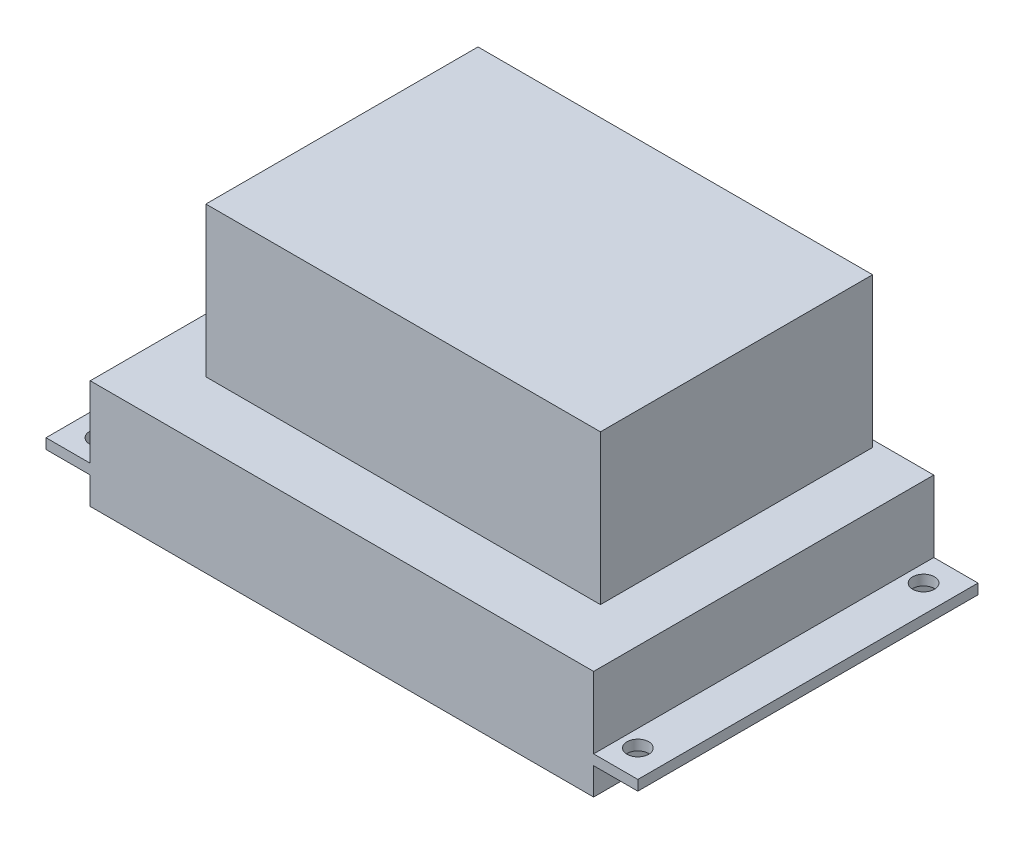
ISO-10303-21;
HEADER;
FILE_DESCRIPTION(('STEP AP214'),'2;1');
FILE_NAME('part.step','',(''),(''),'','','');
FILE_SCHEMA(('AUTOMOTIVE_DESIGN { 1 0 10303 214 1 1 1 1 }'));
ENDSEC;
DATA;
#1=APPLICATION_CONTEXT('core data for automotive mechanical design processes');
#2=APPLICATION_PROTOCOL_DEFINITION('international standard','automotive_design',2000,#1);
#3=PRODUCT_CONTEXT('',#1,'mechanical');
#4=PRODUCT('Part','Part','',(#3));
#5=PRODUCT_RELATED_PRODUCT_CATEGORY('part','',(#4));
#6=PRODUCT_DEFINITION_FORMATION('','',#4);
#7=PRODUCT_DEFINITION_CONTEXT('part definition',#1,'design');
#8=PRODUCT_DEFINITION('design','',#6,#7);
#9=PRODUCT_DEFINITION_SHAPE('','',#8);
#10=(LENGTH_UNIT() NAMED_UNIT(*) SI_UNIT(.MILLI.,.METRE.));
#11=(NAMED_UNIT(*) PLANE_ANGLE_UNIT() SI_UNIT($,.RADIAN.));
#12=(NAMED_UNIT(*) SI_UNIT($,.STERADIAN.) SOLID_ANGLE_UNIT());
#13=UNCERTAINTY_MEASURE_WITH_UNIT(LENGTH_MEASURE(1.E-05),#10,'distance_accuracy_value','');
#14=(GEOMETRIC_REPRESENTATION_CONTEXT(3) GLOBAL_UNCERTAINTY_ASSIGNED_CONTEXT((#13)) GLOBAL_UNIT_ASSIGNED_CONTEXT((#10,
#11,#12)) REPRESENTATION_CONTEXT('',''));
#15=CARTESIAN_POINT('',(0.,0.,0.));
#16=DIRECTION('',(0.,0.,1.));
#17=DIRECTION('',(1.,0.,0.));
#18=AXIS2_PLACEMENT_3D('',#15,#16,#17);
#19=CARTESIAN_POINT('',(0.,1.5,0.));
#20=DIRECTION('',(0.,-1.,0.));
#21=DIRECTION('',(0.,0.,-1.));
#22=AXIS2_PLACEMENT_3D('',#19,#20,#21);
#23=PLANE('',#22);
#24=CARTESIAN_POINT('',(39.4999999999998,1.5,-21.0000000000004));
#25=DIRECTION('',(0.,1.,0.));
#26=DIRECTION('',(0.,0.,-1.));
#27=AXIS2_PLACEMENT_3D('',#24,#25,#26);
#28=CIRCLE('',#27,1.6);
#29=CARTESIAN_POINT('',(39.4999999999998,1.5,-22.6000000000004));
#30=VERTEX_POINT('',#29);
#31=EDGE_CURVE('E249',#30,#30,#28,.T.);
#32=ORIENTED_EDGE('',*,*,#31,.F.);
#33=EDGE_LOOP('',(#32));
#34=FACE_BOUND('',#33,.T.);
#35=CARTESIAN_POINT('',(39.5000000000001,1.5,20.9999999999998));
#36=DIRECTION('',(0.,1.,0.));
#37=DIRECTION('',(0.,0.,1.));
#38=AXIS2_PLACEMENT_3D('',#35,#36,#37);
#39=CIRCLE('',#38,1.6);
#40=CARTESIAN_POINT('',(39.5000000000001,1.5,22.5999999999998));
#41=VERTEX_POINT('',#40);
#42=EDGE_CURVE('E257',#41,#41,#39,.T.);
#43=ORIENTED_EDGE('',*,*,#42,.F.);
#44=EDGE_LOOP('',(#43));
#45=FACE_BOUND('',#44,.T.);
#46=DIRECTION('',(-1.,0.,0.));
#47=VECTOR('',#46,1.);
#48=CARTESIAN_POINT('',(-43.5,1.5,-25.));
#49=LINE('',#48,#47);
#50=CARTESIAN_POINT('',(43.5,1.5,-25.));
#51=VERTEX_POINT('',#50);
#52=CARTESIAN_POINT('',(37.,1.5,-25.));
#53=VERTEX_POINT('',#52);
#54=EDGE_CURVE('E287',#51,#53,#49,.T.);
#55=ORIENTED_EDGE('',*,*,#54,.T.);
#56=DIRECTION('',(0.,0.,1.));
#57=VECTOR('',#56,1.);
#58=CARTESIAN_POINT('',(37.,1.5,0.));
#59=LINE('',#58,#57);
#60=CARTESIAN_POINT('',(37.,1.5,25.));
#61=VERTEX_POINT('',#60);
#62=EDGE_CURVE('E244',#53,#61,#59,.T.);
#63=ORIENTED_EDGE('',*,*,#62,.T.);
#64=DIRECTION('',(1.,0.,0.));
#65=VECTOR('',#64,1.);
#66=CARTESIAN_POINT('',(-43.5,1.5,25.));
#67=LINE('',#66,#65);
#68=CARTESIAN_POINT('',(43.5,1.5,25.));
#69=VERTEX_POINT('',#68);
#70=EDGE_CURVE('E293',#61,#69,#67,.T.);
#71=ORIENTED_EDGE('',*,*,#70,.T.);
#72=DIRECTION('',(0.,0.,-1.));
#73=VECTOR('',#72,1.);
#74=CARTESIAN_POINT('',(43.5,1.5,25.));
#75=LINE('',#74,#73);
#76=EDGE_CURVE('E281',#69,#51,#75,.T.);
#77=ORIENTED_EDGE('',*,*,#76,.T.);
#78=EDGE_LOOP('',(#55,#63,#71,#77));
#79=FACE_BOUND('',#78,.T.);
#80=ADVANCED_FACE('F39',(#34,#45,#79),#23,.F.);
#81=CARTESIAN_POINT('',(0.,0.,0.));
#82=DIRECTION('',(0.,-1.,0.));
#83=DIRECTION('',(0.,0.,-1.));
#84=AXIS2_PLACEMENT_3D('',#81,#82,#83);
#85=PLANE('',#84);
#86=DIRECTION('',(0.,0.,1.));
#87=VECTOR('',#86,1.);
#88=CARTESIAN_POINT('',(37.,0.,0.));
#89=LINE('',#88,#87);
#90=CARTESIAN_POINT('',(37.,0.,-25.));
#91=VERTEX_POINT('',#90);
#92=CARTESIAN_POINT('',(37.,0.,25.));
#93=VERTEX_POINT('',#92);
#94=EDGE_CURVE('E240',#91,#93,#89,.T.);
#95=ORIENTED_EDGE('',*,*,#94,.F.);
#96=DIRECTION('',(-1.,0.,0.));
#97=VECTOR('',#96,1.);
#98=CARTESIAN_POINT('',(-43.5,0.,-25.));
#99=LINE('',#98,#97);
#100=CARTESIAN_POINT('',(43.5,0.,-25.));
#101=VERTEX_POINT('',#100);
#102=EDGE_CURVE('E302',#101,#91,#99,.T.);
#103=ORIENTED_EDGE('',*,*,#102,.F.);
#104=DIRECTION('',(0.,0.,-1.));
#105=VECTOR('',#104,1.);
#106=CARTESIAN_POINT('',(43.5,0.,25.));
#107=LINE('',#106,#105);
#108=CARTESIAN_POINT('',(43.5,0.,25.));
#109=VERTEX_POINT('',#108);
#110=EDGE_CURVE('E277',#109,#101,#107,.T.);
#111=ORIENTED_EDGE('',*,*,#110,.F.);
#112=DIRECTION('',(1.,0.,0.));
#113=VECTOR('',#112,1.);
#114=CARTESIAN_POINT('',(-43.5,0.,25.));
#115=LINE('',#114,#113);
#116=EDGE_CURVE('E309',#93,#109,#115,.T.);
#117=ORIENTED_EDGE('',*,*,#116,.F.);
#118=EDGE_LOOP('',(#95,#103,#111,#117));
#119=FACE_BOUND('',#118,.T.);
#120=CARTESIAN_POINT('',(39.4999999999998,0.,-21.0000000000004));
#121=DIRECTION('',(0.,1.,0.));
#122=DIRECTION('',(0.,0.,-1.));
#123=AXIS2_PLACEMENT_3D('',#120,#121,#122);
#124=CIRCLE('',#123,1.6);
#125=CARTESIAN_POINT('',(39.4999999999998,0.,-22.6000000000004));
#126=VERTEX_POINT('',#125);
#127=EDGE_CURVE('E248',#126,#126,#124,.T.);
#128=ORIENTED_EDGE('',*,*,#127,.T.);
#129=EDGE_LOOP('',(#128));
#130=FACE_BOUND('',#129,.T.);
#131=CARTESIAN_POINT('',(39.5000000000001,0.,20.9999999999998));
#132=DIRECTION('',(0.,1.,0.));
#133=DIRECTION('',(0.,0.,1.));
#134=AXIS2_PLACEMENT_3D('',#131,#132,#133);
#135=CIRCLE('',#134,1.6);
#136=CARTESIAN_POINT('',(39.5000000000001,0.,22.5999999999998));
#137=VERTEX_POINT('',#136);
#138=EDGE_CURVE('E253',#137,#137,#135,.T.);
#139=ORIENTED_EDGE('',*,*,#138,.T.);
#140=EDGE_LOOP('',(#139));
#141=FACE_BOUND('',#140,.T.);
#142=ADVANCED_FACE('F366',(#119,#130,#141),#85,.T.);
#143=CARTESIAN_POINT('',(-43.5,1.5,25.));
#144=VERTEX_POINT('',#143);
#145=CARTESIAN_POINT('',(-37.,1.5,25.));
#146=VERTEX_POINT('',#145);
#147=EDGE_CURVE('E294',#144,#146,#67,.T.);
#148=ORIENTED_EDGE('',*,*,#147,.T.);
#149=DIRECTION('',(0.,0.,-1.));
#150=VECTOR('',#149,1.);
#151=CARTESIAN_POINT('',(-37.,1.5,0.));
#152=LINE('',#151,#150);
#153=CARTESIAN_POINT('',(-37.,1.5,-25.));
#154=VERTEX_POINT('',#153);
#155=EDGE_CURVE('E237',#146,#154,#152,.T.);
#156=ORIENTED_EDGE('',*,*,#155,.T.);
#157=CARTESIAN_POINT('',(-43.5,1.5,-25.));
#158=VERTEX_POINT('',#157);
#159=EDGE_CURVE('E285',#154,#158,#49,.T.);
#160=ORIENTED_EDGE('',*,*,#159,.T.);
#161=DIRECTION('',(0.,0.,1.));
#162=VECTOR('',#161,1.);
#163=CARTESIAN_POINT('',(-43.5,1.5,25.));
#164=LINE('',#163,#162);
#165=EDGE_CURVE('E290',#158,#144,#164,.T.);
#166=ORIENTED_EDGE('',*,*,#165,.T.);
#167=EDGE_LOOP('',(#148,#156,#160,#166));
#168=FACE_BOUND('',#167,.T.);
#169=CARTESIAN_POINT('',(-39.5,1.5,-21.));
#170=DIRECTION('',(0.,1.,0.));
#171=DIRECTION('',(0.,0.,1.));
#172=AXIS2_PLACEMENT_3D('',#169,#170,#171);
#173=CIRCLE('',#172,1.6);
#174=CARTESIAN_POINT('',(-39.5,1.5,-19.4));
#175=VERTEX_POINT('',#174);
#176=EDGE_CURVE('E273',#175,#175,#173,.T.);
#177=ORIENTED_EDGE('',*,*,#176,.F.);
#178=EDGE_LOOP('',(#177));
#179=FACE_BOUND('',#178,.T.);
#180=CARTESIAN_POINT('',(-39.5,1.5,21.));
#181=DIRECTION('',(0.,1.,0.));
#182=DIRECTION('',(0.,0.,-1.));
#183=AXIS2_PLACEMENT_3D('',#180,#181,#182);
#184=CIRCLE('',#183,1.6);
#185=CARTESIAN_POINT('',(-39.5,1.5,19.4));
#186=VERTEX_POINT('',#185);
#187=EDGE_CURVE('E265',#186,#186,#184,.T.);
#188=ORIENTED_EDGE('',*,*,#187,.F.);
#189=EDGE_LOOP('',(#188));
#190=FACE_BOUND('',#189,.T.);
#191=ADVANCED_FACE('F341',(#168,#179,#190),#23,.F.);
#192=DIRECTION('',(0.,0.,-1.));
#193=VECTOR('',#192,1.);
#194=CARTESIAN_POINT('',(-37.,0.,0.));
#195=LINE('',#194,#193);
#196=CARTESIAN_POINT('',(-37.,0.,25.));
#197=VERTEX_POINT('',#196);
#198=CARTESIAN_POINT('',(-37.,0.,-25.));
#199=VERTEX_POINT('',#198);
#200=EDGE_CURVE('E219',#197,#199,#195,.T.);
#201=ORIENTED_EDGE('',*,*,#200,.F.);
#202=CARTESIAN_POINT('',(-43.5,0.,25.));
#203=VERTEX_POINT('',#202);
#204=EDGE_CURVE('E286',#203,#197,#115,.T.);
#205=ORIENTED_EDGE('',*,*,#204,.F.);
#206=DIRECTION('',(0.,0.,1.));
#207=VECTOR('',#206,1.);
#208=CARTESIAN_POINT('',(-43.5,0.,25.));
#209=LINE('',#208,#207);
#210=CARTESIAN_POINT('',(-43.5,0.,-25.));
#211=VERTEX_POINT('',#210);
#212=EDGE_CURVE('E306',#211,#203,#209,.T.);
#213=ORIENTED_EDGE('',*,*,#212,.F.);
#214=EDGE_CURVE('E301',#199,#211,#99,.T.);
#215=ORIENTED_EDGE('',*,*,#214,.F.);
#216=EDGE_LOOP('',(#201,#205,#213,#215));
#217=FACE_BOUND('',#216,.T.);
#218=CARTESIAN_POINT('',(-39.5,0.,-21.));
#219=DIRECTION('',(0.,1.,0.));
#220=DIRECTION('',(0.,0.,1.));
#221=AXIS2_PLACEMENT_3D('',#218,#219,#220);
#222=CIRCLE('',#221,1.6);
#223=CARTESIAN_POINT('',(-39.5,0.,-19.4));
#224=VERTEX_POINT('',#223);
#225=EDGE_CURVE('E269',#224,#224,#222,.T.);
#226=ORIENTED_EDGE('',*,*,#225,.T.);
#227=EDGE_LOOP('',(#226));
#228=FACE_BOUND('',#227,.T.);
#229=CARTESIAN_POINT('',(-39.5,0.,21.));
#230=DIRECTION('',(0.,1.,0.));
#231=DIRECTION('',(0.,0.,-1.));
#232=AXIS2_PLACEMENT_3D('',#229,#230,#231);
#233=CIRCLE('',#232,1.6);
#234=CARTESIAN_POINT('',(-39.5,0.,19.4));
#235=VERTEX_POINT('',#234);
#236=EDGE_CURVE('E261',#235,#235,#233,.T.);
#237=ORIENTED_EDGE('',*,*,#236,.T.);
#238=EDGE_LOOP('',(#237));
#239=FACE_BOUND('',#238,.T.);
#240=ADVANCED_FACE('F333',(#217,#228,#239),#85,.T.);
#241=CARTESIAN_POINT('',(43.5,1.5,25.));
#242=DIRECTION('',(-1.,0.,0.));
#243=DIRECTION('',(0.,0.,1.));
#244=AXIS2_PLACEMENT_3D('',#241,#242,#243);
#245=PLANE('',#244);
#246=ORIENTED_EDGE('',*,*,#110,.T.);
#247=DIRECTION('',(0.,-1.,0.));
#248=VECTOR('',#247,1.);
#249=CARTESIAN_POINT('',(43.5,1.5,-25.));
#250=LINE('',#249,#248);
#251=EDGE_CURVE('E11',#51,#101,#250,.T.);
#252=ORIENTED_EDGE('',*,*,#251,.F.);
#253=ORIENTED_EDGE('',*,*,#76,.F.);
#254=DIRECTION('',(0.,-1.,0.));
#255=VECTOR('',#254,1.);
#256=CARTESIAN_POINT('',(43.5,1.5,25.));
#257=LINE('',#256,#255);
#258=EDGE_CURVE('E297',#69,#109,#257,.T.);
#259=ORIENTED_EDGE('',*,*,#258,.T.);
#260=EDGE_LOOP('',(#246,#252,#253,#259));
#261=FACE_BOUND('',#260,.T.);
#262=ADVANCED_FACE('F41',(#261),#245,.F.);
#263=CARTESIAN_POINT('',(-43.5,1.5,-25.));
#264=DIRECTION('',(0.,0.,1.));
#265=DIRECTION('',(1.,0.,0.));
#266=AXIS2_PLACEMENT_3D('',#263,#264,#265);
#267=PLANE('',#266);
#268=ORIENTED_EDGE('',*,*,#159,.F.);
#269=DIRECTION('',(0.,-1.,0.));
#270=VECTOR('',#269,1.);
#271=CARTESIAN_POINT('',(-37.,12.,-25.));
#272=LINE('',#271,#270);
#273=CARTESIAN_POINT('',(-37.,12.,-25.));
#274=VERTEX_POINT('',#273);
#275=EDGE_CURVE('E221',#274,#154,#272,.T.);
#276=ORIENTED_EDGE('',*,*,#275,.F.);
#277=DIRECTION('',(1.,0.,0.));
#278=VECTOR('',#277,1.);
#279=CARTESIAN_POINT('',(-37.,12.,-25.));
#280=LINE('',#279,#278);
#281=CARTESIAN_POINT('',(37.,12.,-25.));
#282=VERTEX_POINT('',#281);
#283=EDGE_CURVE('E210',#274,#282,#280,.T.);
#284=ORIENTED_EDGE('',*,*,#283,.T.);
#285=DIRECTION('',(0.,-1.,0.));
#286=VECTOR('',#285,1.);
#287=CARTESIAN_POINT('',(37.,12.,-25.));
#288=LINE('',#287,#286);
#289=EDGE_CURVE('E215',#282,#53,#288,.T.);
#290=ORIENTED_EDGE('',*,*,#289,.T.);
#291=ORIENTED_EDGE('',*,*,#54,.F.);
#292=ORIENTED_EDGE('',*,*,#251,.T.);
#293=ORIENTED_EDGE('',*,*,#102,.T.);
#294=CARTESIAN_POINT('',(37.,-4.,-25.));
#295=VERTEX_POINT('',#294);
#296=EDGE_CURVE('E220',#91,#295,#288,.T.);
#297=ORIENTED_EDGE('',*,*,#296,.T.);
#298=DIRECTION('',(1.,0.,0.));
#299=VECTOR('',#298,1.);
#300=CARTESIAN_POINT('',(-37.,-4.,-25.));
#301=LINE('',#300,#299);
#302=CARTESIAN_POINT('',(-37.,-4.,-25.));
#303=VERTEX_POINT('',#302);
#304=EDGE_CURVE('E194',#303,#295,#301,.T.);
#305=ORIENTED_EDGE('',*,*,#304,.F.);
#306=EDGE_CURVE('E225',#199,#303,#272,.T.);
#307=ORIENTED_EDGE('',*,*,#306,.F.);
#308=ORIENTED_EDGE('',*,*,#214,.T.);
#309=DIRECTION('',(0.,-1.,0.));
#310=VECTOR('',#309,1.);
#311=CARTESIAN_POINT('',(-43.5,1.5,-25.));
#312=LINE('',#311,#310);
#313=EDGE_CURVE('E48',#158,#211,#312,.T.);
#314=ORIENTED_EDGE('',*,*,#313,.F.);
#315=EDGE_LOOP('',(#268,#276,#284,#290,#291,#292,#293,#297,#305,#307,#308,#314));
#316=FACE_BOUND('',#315,.T.);
#317=ADVANCED_FACE('F347',(#316),#267,.F.);
#318=CARTESIAN_POINT('',(-43.5,1.5,25.));
#319=DIRECTION('',(1.,0.,0.));
#320=DIRECTION('',(0.,0.,-1.));
#321=AXIS2_PLACEMENT_3D('',#318,#319,#320);
#322=PLANE('',#321);
#323=ORIENTED_EDGE('',*,*,#212,.T.);
#324=DIRECTION('',(0.,-1.,0.));
#325=VECTOR('',#324,1.);
#326=CARTESIAN_POINT('',(-43.5,1.5,25.));
#327=LINE('',#326,#325);
#328=EDGE_CURVE('E316',#144,#203,#327,.T.);
#329=ORIENTED_EDGE('',*,*,#328,.F.);
#330=ORIENTED_EDGE('',*,*,#165,.F.);
#331=ORIENTED_EDGE('',*,*,#313,.T.);
#332=EDGE_LOOP('',(#323,#329,#330,#331));
#333=FACE_BOUND('',#332,.T.);
#334=ADVANCED_FACE('F325',(#333),#322,.F.);
#335=CARTESIAN_POINT('',(-43.5,1.5,25.));
#336=DIRECTION('',(0.,0.,-1.));
#337=DIRECTION('',(-1.,0.,0.));
#338=AXIS2_PLACEMENT_3D('',#335,#336,#337);
#339=PLANE('',#338);
#340=ORIENTED_EDGE('',*,*,#204,.T.);
#341=DIRECTION('',(0.,-1.,0.));
#342=VECTOR('',#341,1.);
#343=CARTESIAN_POINT('',(-37.,12.,25.));
#344=LINE('',#343,#342);
#345=CARTESIAN_POINT('',(-37.,-4.,25.));
#346=VERTEX_POINT('',#345);
#347=EDGE_CURVE('E230',#197,#346,#344,.T.);
#348=ORIENTED_EDGE('',*,*,#347,.T.);
#349=DIRECTION('',(-1.,0.,0.));
#350=VECTOR('',#349,1.);
#351=CARTESIAN_POINT('',(-37.,-4.,25.));
#352=LINE('',#351,#350);
#353=CARTESIAN_POINT('',(37.,-4.,25.));
#354=VERTEX_POINT('',#353);
#355=EDGE_CURVE('E181',#354,#346,#352,.T.);
#356=ORIENTED_EDGE('',*,*,#355,.F.);
#357=DIRECTION('',(0.,-1.,0.));
#358=VECTOR('',#357,1.);
#359=CARTESIAN_POINT('',(37.,12.,25.));
#360=LINE('',#359,#358);
#361=EDGE_CURVE('E214',#93,#354,#360,.T.);
#362=ORIENTED_EDGE('',*,*,#361,.F.);
#363=ORIENTED_EDGE('',*,*,#116,.T.);
#364=ORIENTED_EDGE('',*,*,#258,.F.);
#365=ORIENTED_EDGE('',*,*,#70,.F.);
#366=CARTESIAN_POINT('',(37.,12.,25.));
#367=VERTEX_POINT('',#366);
#368=EDGE_CURVE('E231',#367,#61,#360,.T.);
#369=ORIENTED_EDGE('',*,*,#368,.F.);
#370=DIRECTION('',(-1.,0.,0.));
#371=VECTOR('',#370,1.);
#372=CARTESIAN_POINT('',(-37.,12.,25.));
#373=LINE('',#372,#371);
#374=CARTESIAN_POINT('',(-37.,12.,25.));
#375=VERTEX_POINT('',#374);
#376=EDGE_CURVE('E202',#367,#375,#373,.T.);
#377=ORIENTED_EDGE('',*,*,#376,.T.);
#378=EDGE_CURVE('E226',#375,#146,#344,.T.);
#379=ORIENTED_EDGE('',*,*,#378,.T.);
#380=ORIENTED_EDGE('',*,*,#147,.F.);
#381=ORIENTED_EDGE('',*,*,#328,.T.);
#382=EDGE_LOOP('',(#340,#348,#356,#362,#363,#364,#365,#369,#377,#379,#380,#381));
#383=FACE_BOUND('',#382,.T.);
#384=ADVANCED_FACE('F336',(#383),#339,.F.);
#385=CARTESIAN_POINT('',(-39.5,1.5,-21.));
#386=DIRECTION('',(0.,-1.,0.));
#387=DIRECTION('',(0.,0.,-1.));
#388=AXIS2_PLACEMENT_3D('',#385,#386,#387);
#389=CYLINDRICAL_SURFACE('',#388,1.6);
#390=ORIENTED_EDGE('',*,*,#176,.T.);
#391=EDGE_LOOP('',(#390));
#392=FACE_BOUND('',#391,.T.);
#393=ORIENTED_EDGE('',*,*,#225,.F.);
#394=EDGE_LOOP('',(#393));
#395=FACE_BOUND('',#394,.T.);
#396=ADVANCED_FACE('F411',(#392,#395),#389,.F.);
#397=CARTESIAN_POINT('',(-39.5,1.5,21.));
#398=DIRECTION('',(0.,-1.,0.));
#399=DIRECTION('',(0.,0.,-1.));
#400=AXIS2_PLACEMENT_3D('',#397,#398,#399);
#401=CYLINDRICAL_SURFACE('',#400,1.6);
#402=ORIENTED_EDGE('',*,*,#187,.T.);
#403=EDGE_LOOP('',(#402));
#404=FACE_BOUND('',#403,.T.);
#405=ORIENTED_EDGE('',*,*,#236,.F.);
#406=EDGE_LOOP('',(#405));
#407=FACE_BOUND('',#406,.T.);
#408=ADVANCED_FACE('F433',(#404,#407),#401,.F.);
#409=CARTESIAN_POINT('',(39.5000000000001,1.5,20.9999999999998));
#410=DIRECTION('',(0.,-1.,0.));
#411=DIRECTION('',(0.,0.,-1.));
#412=AXIS2_PLACEMENT_3D('',#409,#410,#411);
#413=CYLINDRICAL_SURFACE('',#412,1.6);
#414=ORIENTED_EDGE('',*,*,#42,.T.);
#415=EDGE_LOOP('',(#414));
#416=FACE_BOUND('',#415,.T.);
#417=ORIENTED_EDGE('',*,*,#138,.F.);
#418=EDGE_LOOP('',(#417));
#419=FACE_BOUND('',#418,.T.);
#420=ADVANCED_FACE('F440',(#416,#419),#413,.F.);
#421=CARTESIAN_POINT('',(39.4999999999998,1.5,-21.0000000000004));
#422=DIRECTION('',(0.,-1.,0.));
#423=DIRECTION('',(0.,0.,-1.));
#424=AXIS2_PLACEMENT_3D('',#421,#422,#423);
#425=CYLINDRICAL_SURFACE('',#424,1.6);
#426=ORIENTED_EDGE('',*,*,#31,.T.);
#427=EDGE_LOOP('',(#426));
#428=FACE_BOUND('',#427,.T.);
#429=ORIENTED_EDGE('',*,*,#127,.F.);
#430=EDGE_LOOP('',(#429));
#431=FACE_BOUND('',#430,.T.);
#432=ADVANCED_FACE('F448',(#428,#431),#425,.F.);
#433=CARTESIAN_POINT('',(0.,-4.,0.));
#434=DIRECTION('',(0.,1.,0.));
#435=DIRECTION('',(0.,0.,1.));
#436=AXIS2_PLACEMENT_3D('',#433,#434,#435);
#437=PLANE('',#436);
#438=DIRECTION('',(0.,0.,1.));
#439=VECTOR('',#438,1.);
#440=CARTESIAN_POINT('',(37.,-4.,-25.));
#441=LINE('',#440,#439);
#442=EDGE_CURVE('E176',#295,#354,#441,.T.);
#443=ORIENTED_EDGE('',*,*,#442,.T.);
#444=ORIENTED_EDGE('',*,*,#355,.T.);
#445=DIRECTION('',(0.,0.,-1.));
#446=VECTOR('',#445,1.);
#447=CARTESIAN_POINT('',(-37.,-4.,-25.));
#448=LINE('',#447,#446);
#449=EDGE_CURVE('E190',#346,#303,#448,.T.);
#450=ORIENTED_EDGE('',*,*,#449,.T.);
#451=ORIENTED_EDGE('',*,*,#304,.T.);
#452=EDGE_LOOP('',(#443,#444,#450,#451));
#453=FACE_BOUND('',#452,.T.);
#454=ADVANCED_FACE('F362',(#453),#437,.F.);
#455=CARTESIAN_POINT('',(-37.,12.,-25.));
#456=DIRECTION('',(-1.,0.,0.));
#457=DIRECTION('',(0.,0.,1.));
#458=AXIS2_PLACEMENT_3D('',#455,#456,#457);
#459=PLANE('',#458);
#460=ORIENTED_EDGE('',*,*,#347,.F.);
#461=ORIENTED_EDGE('',*,*,#200,.T.);
#462=ORIENTED_EDGE('',*,*,#306,.T.);
#463=ORIENTED_EDGE('',*,*,#449,.F.);
#464=EDGE_LOOP('',(#460,#461,#462,#463));
#465=FACE_BOUND('',#464,.T.);
#466=ADVANCED_FACE('F389',(#465),#459,.T.);
#467=CARTESIAN_POINT('',(37.,12.,-25.));
#468=DIRECTION('',(1.,0.,0.));
#469=DIRECTION('',(0.,0.,-1.));
#470=AXIS2_PLACEMENT_3D('',#467,#468,#469);
#471=PLANE('',#470);
#472=ORIENTED_EDGE('',*,*,#296,.F.);
#473=ORIENTED_EDGE('',*,*,#94,.T.);
#474=ORIENTED_EDGE('',*,*,#361,.T.);
#475=ORIENTED_EDGE('',*,*,#442,.F.);
#476=EDGE_LOOP('',(#472,#473,#474,#475));
#477=FACE_BOUND('',#476,.T.);
#478=ADVANCED_FACE('F357',(#477),#471,.T.);
#479=ORIENTED_EDGE('',*,*,#62,.F.);
#480=ORIENTED_EDGE('',*,*,#289,.F.);
#481=DIRECTION('',(0.,0.,1.));
#482=VECTOR('',#481,1.);
#483=CARTESIAN_POINT('',(37.,12.,-25.));
#484=LINE('',#483,#482);
#485=EDGE_CURVE('E198',#282,#367,#484,.T.);
#486=ORIENTED_EDGE('',*,*,#485,.T.);
#487=ORIENTED_EDGE('',*,*,#368,.T.);
#488=EDGE_LOOP('',(#479,#480,#486,#487));
#489=FACE_BOUND('',#488,.T.);
#490=ADVANCED_FACE('F381',(#489),#471,.T.);
#491=ORIENTED_EDGE('',*,*,#155,.F.);
#492=ORIENTED_EDGE('',*,*,#378,.F.);
#493=DIRECTION('',(0.,0.,-1.));
#494=VECTOR('',#493,1.);
#495=CARTESIAN_POINT('',(-37.,12.,-25.));
#496=LINE('',#495,#494);
#497=EDGE_CURVE('E206',#375,#274,#496,.T.);
#498=ORIENTED_EDGE('',*,*,#497,.T.);
#499=ORIENTED_EDGE('',*,*,#275,.T.);
#500=EDGE_LOOP('',(#491,#492,#498,#499));
#501=FACE_BOUND('',#500,.T.);
#502=ADVANCED_FACE('F344',(#501),#459,.T.);
#503=CARTESIAN_POINT('',(0.,12.,0.));
#504=DIRECTION('',(0.,1.,0.));
#505=DIRECTION('',(0.,0.,1.));
#506=AXIS2_PLACEMENT_3D('',#503,#504,#505);
#507=PLANE('',#506);
#508=DIRECTION('',(0.,0.,1.));
#509=VECTOR('',#508,1.);
#510=CARTESIAN_POINT('',(-29.,12.,-24.));
#511=LINE('',#510,#509);
#512=CARTESIAN_POINT('',(-29.,12.,-24.));
#513=VERTEX_POINT('',#512);
#514=CARTESIAN_POINT('',(-29.,12.,16.));
#515=VERTEX_POINT('',#514);
#516=EDGE_CURVE('E55',#513,#515,#511,.T.);
#517=ORIENTED_EDGE('',*,*,#516,.F.);
#518=DIRECTION('',(-1.,0.,0.));
#519=VECTOR('',#518,1.);
#520=CARTESIAN_POINT('',(-29.,12.,-24.));
#521=LINE('',#520,#519);
#522=CARTESIAN_POINT('',(29.,12.,-24.));
#523=VERTEX_POINT('',#522);
#524=EDGE_CURVE('E59',#523,#513,#521,.T.);
#525=ORIENTED_EDGE('',*,*,#524,.F.);
#526=DIRECTION('',(0.,0.,-1.));
#527=VECTOR('',#526,1.);
#528=CARTESIAN_POINT('',(29.,12.,-24.));
#529=LINE('',#528,#527);
#530=CARTESIAN_POINT('',(29.,12.,16.));
#531=VERTEX_POINT('',#530);
#532=EDGE_CURVE('E541',#531,#523,#529,.T.);
#533=ORIENTED_EDGE('',*,*,#532,.F.);
#534=DIRECTION('',(1.,0.,0.));
#535=VECTOR('',#534,1.);
#536=CARTESIAN_POINT('',(-29.,12.,16.));
#537=LINE('',#536,#535);
#538=EDGE_CURVE('E551',#515,#531,#537,.T.);
#539=ORIENTED_EDGE('',*,*,#538,.F.);
#540=EDGE_LOOP('',(#517,#525,#533,#539));
#541=FACE_BOUND('',#540,.T.);
#542=ORIENTED_EDGE('',*,*,#485,.F.);
#543=ORIENTED_EDGE('',*,*,#283,.F.);
#544=ORIENTED_EDGE('',*,*,#497,.F.);
#545=ORIENTED_EDGE('',*,*,#376,.F.);
#546=EDGE_LOOP('',(#542,#543,#544,#545));
#547=FACE_BOUND('',#546,.T.);
#548=ADVANCED_FACE('F380',(#541,#547),#507,.T.);
#549=CARTESIAN_POINT('',(-29.,34.,-24.));
#550=DIRECTION('',(1.,0.,0.));
#551=DIRECTION('',(0.,0.,-1.));
#552=AXIS2_PLACEMENT_3D('',#549,#550,#551);
#553=PLANE('',#552);
#554=ORIENTED_EDGE('',*,*,#516,.T.);
#555=DIRECTION('',(0.,-1.,0.));
#556=VECTOR('',#555,1.);
#557=CARTESIAN_POINT('',(-29.,34.,16.));
#558=LINE('',#557,#556);
#559=CARTESIAN_POINT('',(-29.,34.,16.));
#560=VERTEX_POINT('',#559);
#561=EDGE_CURVE('E156',#560,#515,#558,.T.);
#562=ORIENTED_EDGE('',*,*,#561,.F.);
#563=DIRECTION('',(0.,0.,1.));
#564=VECTOR('',#563,1.);
#565=CARTESIAN_POINT('',(-29.,34.,-24.));
#566=LINE('',#565,#564);
#567=CARTESIAN_POINT('',(-29.,34.,-24.));
#568=VERTEX_POINT('',#567);
#569=EDGE_CURVE('E163',#568,#560,#566,.T.);
#570=ORIENTED_EDGE('',*,*,#569,.F.);
#571=DIRECTION('',(0.,-1.,0.));
#572=VECTOR('',#571,1.);
#573=CARTESIAN_POINT('',(-29.,34.,-24.));
#574=LINE('',#573,#572);
#575=EDGE_CURVE('E538',#568,#513,#574,.T.);
#576=ORIENTED_EDGE('',*,*,#575,.T.);
#577=EDGE_LOOP('',(#554,#562,#570,#576));
#578=FACE_BOUND('',#577,.T.);
#579=ADVANCED_FACE('F174',(#578),#553,.F.);
#580=CARTESIAN_POINT('',(-29.,34.,16.));
#581=DIRECTION('',(0.,0.,-1.));
#582=DIRECTION('',(-1.,0.,0.));
#583=AXIS2_PLACEMENT_3D('',#580,#581,#582);
#584=PLANE('',#583);
#585=ORIENTED_EDGE('',*,*,#538,.T.);
#586=DIRECTION('',(0.,-1.,0.));
#587=VECTOR('',#586,1.);
#588=CARTESIAN_POINT('',(29.,34.,16.));
#589=LINE('',#588,#587);
#590=CARTESIAN_POINT('',(29.,34.,16.));
#591=VERTEX_POINT('',#590);
#592=EDGE_CURVE('E158',#591,#531,#589,.T.);
#593=ORIENTED_EDGE('',*,*,#592,.F.);
#594=DIRECTION('',(1.,0.,0.));
#595=VECTOR('',#594,1.);
#596=CARTESIAN_POINT('',(-29.,34.,16.));
#597=LINE('',#596,#595);
#598=EDGE_CURVE('E151',#560,#591,#597,.T.);
#599=ORIENTED_EDGE('',*,*,#598,.F.);
#600=ORIENTED_EDGE('',*,*,#561,.T.);
#601=EDGE_LOOP('',(#585,#593,#599,#600));
#602=FACE_BOUND('',#601,.T.);
#603=ADVANCED_FACE('F154',(#602),#584,.F.);
#604=CARTESIAN_POINT('',(29.,34.,-24.));
#605=DIRECTION('',(-1.,0.,0.));
#606=DIRECTION('',(0.,0.,1.));
#607=AXIS2_PLACEMENT_3D('',#604,#605,#606);
#608=PLANE('',#607);
#609=ORIENTED_EDGE('',*,*,#532,.T.);
#610=DIRECTION('',(0.,-1.,0.));
#611=VECTOR('',#610,1.);
#612=CARTESIAN_POINT('',(29.,34.,-24.));
#613=LINE('',#612,#611);
#614=CARTESIAN_POINT('',(29.,34.,-24.));
#615=VERTEX_POINT('',#614);
#616=EDGE_CURVE('E183',#615,#523,#613,.T.);
#617=ORIENTED_EDGE('',*,*,#616,.F.);
#618=DIRECTION('',(0.,0.,-1.));
#619=VECTOR('',#618,1.);
#620=CARTESIAN_POINT('',(29.,34.,-24.));
#621=LINE('',#620,#619);
#622=EDGE_CURVE('E162',#591,#615,#621,.T.);
#623=ORIENTED_EDGE('',*,*,#622,.F.);
#624=ORIENTED_EDGE('',*,*,#592,.T.);
#625=EDGE_LOOP('',(#609,#617,#623,#624));
#626=FACE_BOUND('',#625,.T.);
#627=ADVANCED_FACE('F506',(#626),#608,.F.);
#628=CARTESIAN_POINT('',(-29.,34.,-24.));
#629=DIRECTION('',(0.,0.,1.));
#630=DIRECTION('',(1.,0.,0.));
#631=AXIS2_PLACEMENT_3D('',#628,#629,#630);
#632=PLANE('',#631);
#633=ORIENTED_EDGE('',*,*,#524,.T.);
#634=ORIENTED_EDGE('',*,*,#575,.F.);
#635=DIRECTION('',(-1.,0.,0.));
#636=VECTOR('',#635,1.);
#637=CARTESIAN_POINT('',(-29.,34.,-24.));
#638=LINE('',#637,#636);
#639=EDGE_CURVE('E168',#615,#568,#638,.T.);
#640=ORIENTED_EDGE('',*,*,#639,.F.);
#641=ORIENTED_EDGE('',*,*,#616,.T.);
#642=EDGE_LOOP('',(#633,#634,#640,#641));
#643=FACE_BOUND('',#642,.T.);
#644=ADVANCED_FACE('F515',(#643),#632,.F.);
#645=CARTESIAN_POINT('',(0.,34.,0.));
#646=DIRECTION('',(0.,1.,0.));
#647=DIRECTION('',(0.,0.,1.));
#648=AXIS2_PLACEMENT_3D('',#645,#646,#647);
#649=PLANE('',#648);
#650=ORIENTED_EDGE('',*,*,#569,.T.);
#651=ORIENTED_EDGE('',*,*,#598,.T.);
#652=ORIENTED_EDGE('',*,*,#622,.T.);
#653=ORIENTED_EDGE('',*,*,#639,.T.);
#654=EDGE_LOOP('',(#650,#651,#652,#653));
#655=FACE_BOUND('',#654,.T.);
#656=ADVANCED_FACE('F166',(#655),#649,.T.);
#657=CLOSED_SHELL('',(#80,#142,#191,#240,#262,#317,#334,#384,#396,#408,#420,#432,#454,#466,#478,
#490,#502,#548,#579,#603,#627,#644,#656));
#658=MANIFOLD_SOLID_BREP('B2',#657);
#659=ADVANCED_BREP_SHAPE_REPRESENTATION('',(#18,#658),#14);
#660=SHAPE_DEFINITION_REPRESENTATION(#9,#659);
ENDSEC;
END-ISO-10303-21;
